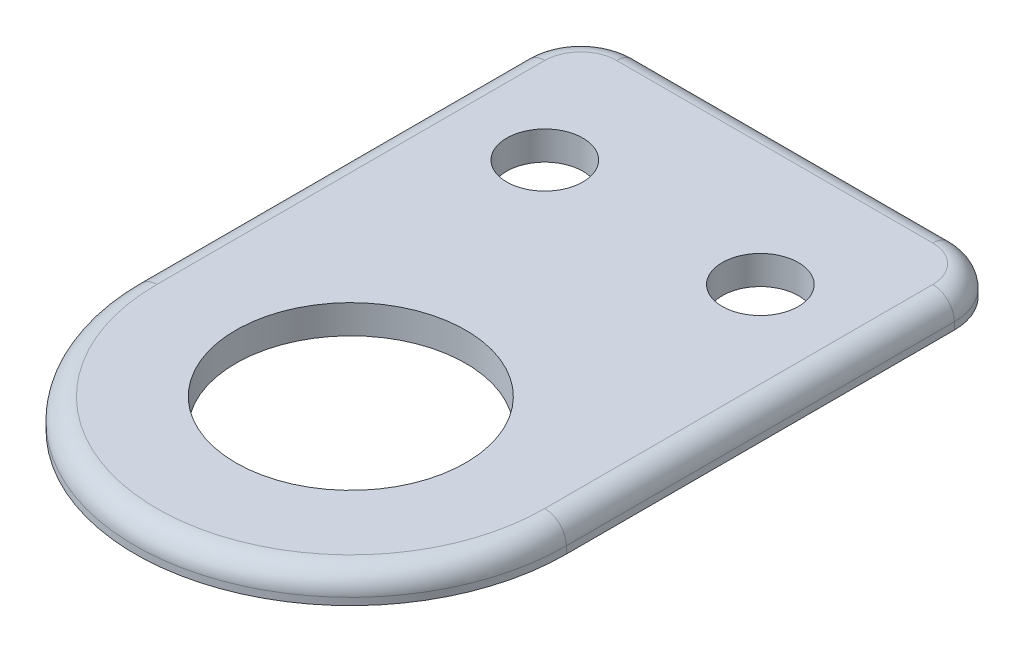
ISO-10303-21;
HEADER;
FILE_DESCRIPTION(('STEP AP214'),'2;1');
FILE_NAME('part.step','',(''),(''),'','','');
FILE_SCHEMA(('AUTOMOTIVE_DESIGN { 1 0 10303 214 1 1 1 1 }'));
ENDSEC;
DATA;
#1=APPLICATION_CONTEXT('core data for automotive mechanical design processes');
#2=APPLICATION_PROTOCOL_DEFINITION('international standard','automotive_design',2000,#1);
#3=PRODUCT_CONTEXT('',#1,'mechanical');
#4=PRODUCT('Part','Part','',(#3));
#5=PRODUCT_RELATED_PRODUCT_CATEGORY('part','',(#4));
#6=PRODUCT_DEFINITION_FORMATION('','',#4);
#7=PRODUCT_DEFINITION_CONTEXT('part definition',#1,'design');
#8=PRODUCT_DEFINITION('design','',#6,#7);
#9=PRODUCT_DEFINITION_SHAPE('','',#8);
#10=(LENGTH_UNIT() NAMED_UNIT(*) SI_UNIT(.MILLI.,.METRE.));
#11=(NAMED_UNIT(*) PLANE_ANGLE_UNIT() SI_UNIT($,.RADIAN.));
#12=(NAMED_UNIT(*) SI_UNIT($,.STERADIAN.) SOLID_ANGLE_UNIT());
#13=UNCERTAINTY_MEASURE_WITH_UNIT(LENGTH_MEASURE(1.E-05),#10,'distance_accuracy_value','');
#14=(GEOMETRIC_REPRESENTATION_CONTEXT(3) GLOBAL_UNCERTAINTY_ASSIGNED_CONTEXT((#13)) GLOBAL_UNIT_ASSIGNED_CONTEXT((#10,
#11,#12)) REPRESENTATION_CONTEXT('',''));
#15=CARTESIAN_POINT('',(0.,0.,0.));
#16=DIRECTION('',(0.,0.,1.));
#17=DIRECTION('',(1.,0.,0.));
#18=AXIS2_PLACEMENT_3D('',#15,#16,#17);
#19=CARTESIAN_POINT('',(0.,2.,0.));
#20=DIRECTION('',(0.,1.,0.));
#21=DIRECTION('',(0.,0.,1.));
#22=AXIS2_PLACEMENT_3D('',#19,#20,#21);
#23=PLANE('',#22);
#24=CARTESIAN_POINT('',(0.,2.,0.));
#25=DIRECTION('',(0.,1.,0.));
#26=DIRECTION('',(0.,0.,1.));
#27=AXIS2_PLACEMENT_3D('',#24,#25,#26);
#28=CIRCLE('',#27,13.5);
#29=CARTESIAN_POINT('',(-13.5,2.,0.));
#30=VERTEX_POINT('',#29);
#31=CARTESIAN_POINT('',(13.5,2.,0.));
#32=VERTEX_POINT('',#31);
#33=EDGE_CURVE('E197',#30,#32,#28,.T.);
#34=ORIENTED_EDGE('',*,*,#33,.T.);
#35=DIRECTION('',(0.,0.,-1.));
#36=VECTOR('',#35,1.);
#37=CARTESIAN_POINT('',(13.5,2.,-27.));
#38=LINE('',#37,#36);
#39=CARTESIAN_POINT('',(13.5,2.,-27.));
#40=VERTEX_POINT('',#39);
#41=EDGE_CURVE('E212',#32,#40,#38,.T.);
#42=ORIENTED_EDGE('',*,*,#41,.T.);
#43=CARTESIAN_POINT('',(11.,2.,-27.));
#44=DIRECTION('',(0.,1.,0.));
#45=DIRECTION('',(0.,0.,1.));
#46=AXIS2_PLACEMENT_3D('',#43,#44,#45);
#47=CIRCLE('',#46,2.5);
#48=CARTESIAN_POINT('',(11.,2.,-29.5));
#49=VERTEX_POINT('',#48);
#50=EDGE_CURVE('E209',#40,#49,#47,.T.);
#51=ORIENTED_EDGE('',*,*,#50,.T.);
#52=DIRECTION('',(1.,0.,0.));
#53=VECTOR('',#52,1.);
#54=CARTESIAN_POINT('',(0.,2.,-29.5));
#55=LINE('',#54,#53);
#56=CARTESIAN_POINT('',(-11.,2.,-29.5));
#57=VERTEX_POINT('',#56);
#58=EDGE_CURVE('E206',#49,#57,#55,.F.);
#59=ORIENTED_EDGE('',*,*,#58,.T.);
#60=CARTESIAN_POINT('',(-11.,2.,-27.));
#61=DIRECTION('',(0.,1.,0.));
#62=DIRECTION('',(0.,0.,1.));
#63=AXIS2_PLACEMENT_3D('',#60,#61,#62);
#64=CIRCLE('',#63,2.5);
#65=CARTESIAN_POINT('',(-13.5,2.,-27.));
#66=VERTEX_POINT('',#65);
#67=EDGE_CURVE('E203',#57,#66,#64,.T.);
#68=ORIENTED_EDGE('',*,*,#67,.T.);
#69=DIRECTION('',(0.,0.,-1.));
#70=VECTOR('',#69,1.);
#71=CARTESIAN_POINT('',(-13.5,2.,0.));
#72=LINE('',#71,#70);
#73=EDGE_CURVE('E200',#66,#30,#72,.F.);
#74=ORIENTED_EDGE('',*,*,#73,.T.);
#75=EDGE_LOOP('',(#34,#42,#51,#59,#68,#74));
#76=FACE_BOUND('',#75,.T.);
#77=CARTESIAN_POINT('',(-7.5,2.,-21.));
#78=DIRECTION('',(0.,1.,0.));
#79=DIRECTION('',(0.,0.,1.));
#80=AXIS2_PLACEMENT_3D('',#77,#78,#79);
#81=CIRCLE('',#80,2.65);
#82=CARTESIAN_POINT('',(-7.5,2.,-18.35));
#83=VERTEX_POINT('',#82);
#84=EDGE_CURVE('E250',#83,#83,#81,.T.);
#85=ORIENTED_EDGE('',*,*,#84,.F.);
#86=EDGE_LOOP('',(#85));
#87=FACE_BOUND('',#86,.T.);
#88=CARTESIAN_POINT('',(7.5,2.,-21.));
#89=DIRECTION('',(0.,1.,0.));
#90=DIRECTION('',(0.,0.,1.));
#91=AXIS2_PLACEMENT_3D('',#88,#89,#90);
#92=CIRCLE('',#91,2.65);
#93=CARTESIAN_POINT('',(7.5,2.,-18.35));
#94=VERTEX_POINT('',#93);
#95=EDGE_CURVE('E263',#94,#94,#92,.T.);
#96=ORIENTED_EDGE('',*,*,#95,.F.);
#97=EDGE_LOOP('',(#96));
#98=FACE_BOUND('',#97,.T.);
#99=CARTESIAN_POINT('',(0.,2.,0.));
#100=DIRECTION('',(0.,1.,0.));
#101=DIRECTION('',(0.,0.,1.));
#102=AXIS2_PLACEMENT_3D('',#99,#100,#101);
#103=CIRCLE('',#102,8.);
#104=CARTESIAN_POINT('',(0.,2.,8.));
#105=VERTEX_POINT('',#104);
#106=EDGE_CURVE('E164',#105,#105,#103,.T.);
#107=ORIENTED_EDGE('',*,*,#106,.F.);
#108=EDGE_LOOP('',(#107));
#109=FACE_BOUND('',#108,.T.);
#110=ADVANCED_FACE('F64',(#76,#87,#98,#109),#23,.T.);
#111=CARTESIAN_POINT('',(0.,0.,0.));
#112=DIRECTION('',(0.,1.,0.));
#113=DIRECTION('',(0.,0.,1.));
#114=AXIS2_PLACEMENT_3D('',#111,#112,#113);
#115=PLANE('',#114);
#116=CARTESIAN_POINT('',(-7.5,0.,-21.));
#117=DIRECTION('',(0.,1.,0.));
#118=DIRECTION('',(0.,0.,1.));
#119=AXIS2_PLACEMENT_3D('',#116,#117,#118);
#120=CIRCLE('',#119,2.65);
#121=CARTESIAN_POINT('',(-7.5,0.,-18.35));
#122=VERTEX_POINT('',#121);
#123=EDGE_CURVE('E256',#122,#122,#120,.T.);
#124=ORIENTED_EDGE('',*,*,#123,.T.);
#125=EDGE_LOOP('',(#124));
#126=FACE_BOUND('',#125,.T.);
#127=CARTESIAN_POINT('',(7.5,0.,-21.));
#128=DIRECTION('',(0.,1.,0.));
#129=DIRECTION('',(0.,0.,1.));
#130=AXIS2_PLACEMENT_3D('',#127,#128,#129);
#131=CIRCLE('',#130,2.65);
#132=CARTESIAN_POINT('',(7.5,0.,-18.35));
#133=VERTEX_POINT('',#132);
#134=EDGE_CURVE('E269',#133,#133,#131,.T.);
#135=ORIENTED_EDGE('',*,*,#134,.T.);
#136=EDGE_LOOP('',(#135));
#137=FACE_BOUND('',#136,.T.);
#138=DIRECTION('',(1.,0.,0.));
#139=VECTOR('',#138,1.);
#140=CARTESIAN_POINT('',(0.,0.,-31.));
#141=LINE('',#140,#139);
#142=CARTESIAN_POINT('',(-11.,0.,-31.));
#143=VERTEX_POINT('',#142);
#144=CARTESIAN_POINT('',(11.,0.,-31.));
#145=VERTEX_POINT('',#144);
#146=EDGE_CURVE('E160',#143,#145,#141,.T.);
#147=ORIENTED_EDGE('',*,*,#146,.T.);
#148=CARTESIAN_POINT('',(11.,0.,-27.));
#149=DIRECTION('',(0.,1.,0.));
#150=DIRECTION('',(0.,0.,1.));
#151=AXIS2_PLACEMENT_3D('',#148,#149,#150);
#152=CIRCLE('',#151,4.);
#153=CARTESIAN_POINT('',(15.,0.,-27.));
#154=VERTEX_POINT('',#153);
#155=EDGE_CURVE('E158',#145,#154,#152,.F.);
#156=ORIENTED_EDGE('',*,*,#155,.T.);
#157=DIRECTION('',(0.,0.,-1.));
#158=VECTOR('',#157,1.);
#159=CARTESIAN_POINT('',(15.,0.,0.));
#160=LINE('',#159,#158);
#161=CARTESIAN_POINT('',(15.,0.,0.));
#162=VERTEX_POINT('',#161);
#163=EDGE_CURVE('E140',#162,#154,#160,.T.);
#164=ORIENTED_EDGE('',*,*,#163,.F.);
#165=CARTESIAN_POINT('',(0.,0.,0.));
#166=DIRECTION('',(0.,1.,0.));
#167=DIRECTION('',(0.,0.,1.));
#168=AXIS2_PLACEMENT_3D('',#165,#166,#167);
#169=CIRCLE('',#168,15.);
#170=CARTESIAN_POINT('',(-15.,0.,0.));
#171=VERTEX_POINT('',#170);
#172=EDGE_CURVE('E155',#162,#171,#169,.F.);
#173=ORIENTED_EDGE('',*,*,#172,.T.);
#174=DIRECTION('',(0.,0.,-1.));
#175=VECTOR('',#174,1.);
#176=CARTESIAN_POINT('',(-15.,0.,0.));
#177=LINE('',#176,#175);
#178=CARTESIAN_POINT('',(-15.,0.,-27.));
#179=VERTEX_POINT('',#178);
#180=EDGE_CURVE('E175',#171,#179,#177,.T.);
#181=ORIENTED_EDGE('',*,*,#180,.T.);
#182=CARTESIAN_POINT('',(-11.,0.,-27.));
#183=DIRECTION('',(0.,1.,0.));
#184=DIRECTION('',(0.,0.,1.));
#185=AXIS2_PLACEMENT_3D('',#182,#183,#184);
#186=CIRCLE('',#185,4.);
#187=EDGE_CURVE('E186',#179,#143,#186,.F.);
#188=ORIENTED_EDGE('',*,*,#187,.T.);
#189=EDGE_LOOP('',(#147,#156,#164,#173,#181,#188));
#190=FACE_BOUND('',#189,.T.);
#191=CARTESIAN_POINT('',(0.,0.,0.));
#192=DIRECTION('',(0.,1.,0.));
#193=DIRECTION('',(0.,0.,1.));
#194=AXIS2_PLACEMENT_3D('',#191,#192,#193);
#195=CIRCLE('',#194,8.);
#196=CARTESIAN_POINT('',(0.,0.,8.));
#197=VERTEX_POINT('',#196);
#198=EDGE_CURVE('E169',#197,#197,#195,.T.);
#199=ORIENTED_EDGE('',*,*,#198,.T.);
#200=EDGE_LOOP('',(#199));
#201=FACE_BOUND('',#200,.T.);
#202=ADVANCED_FACE('F152',(#126,#137,#190,#201),#115,.F.);
#203=CARTESIAN_POINT('',(0.,2.,0.));
#204=DIRECTION('',(0.,-1.,0.));
#205=DIRECTION('',(0.,0.,-1.));
#206=AXIS2_PLACEMENT_3D('',#203,#204,#205);
#207=CYLINDRICAL_SURFACE('',#206,15.);
#208=DIRECTION('',(0.,-1.,0.));
#209=VECTOR('',#208,1.);
#210=CARTESIAN_POINT('',(15.,2.,0.));
#211=LINE('',#210,#209);
#212=CARTESIAN_POINT('',(15.,0.5,0.));
#213=VERTEX_POINT('',#212);
#214=EDGE_CURVE('E136',#213,#162,#211,.T.);
#215=ORIENTED_EDGE('',*,*,#214,.F.);
#216=CARTESIAN_POINT('',(0.,0.5,0.));
#217=DIRECTION('',(0.,1.,0.));
#218=DIRECTION('',(0.,0.,1.));
#219=AXIS2_PLACEMENT_3D('',#216,#217,#218);
#220=CIRCLE('',#219,15.);
#221=CARTESIAN_POINT('',(-15.,0.5,0.));
#222=VERTEX_POINT('',#221);
#223=EDGE_CURVE('E12',#213,#222,#220,.F.);
#224=ORIENTED_EDGE('',*,*,#223,.T.);
#225=DIRECTION('',(0.,-1.,0.));
#226=VECTOR('',#225,1.);
#227=CARTESIAN_POINT('',(-15.,2.,0.));
#228=LINE('',#227,#226);
#229=EDGE_CURVE('E147',#222,#171,#228,.T.);
#230=ORIENTED_EDGE('',*,*,#229,.T.);
#231=ORIENTED_EDGE('',*,*,#172,.F.);
#232=EDGE_LOOP('',(#215,#224,#230,#231));
#233=FACE_BOUND('',#232,.T.);
#234=ADVANCED_FACE('F162',(#233),#207,.T.);
#235=CARTESIAN_POINT('',(15.,2.,0.));
#236=DIRECTION('',(-1.,0.,0.));
#237=DIRECTION('',(0.,0.,1.));
#238=AXIS2_PLACEMENT_3D('',#235,#236,#237);
#239=PLANE('',#238);
#240=DIRECTION('',(0.,-1.,0.));
#241=VECTOR('',#240,1.);
#242=CARTESIAN_POINT('',(15.,2.,-27.));
#243=LINE('',#242,#241);
#244=CARTESIAN_POINT('',(15.,0.5,-27.));
#245=VERTEX_POINT('',#244);
#246=EDGE_CURVE('E191',#154,#245,#243,.F.);
#247=ORIENTED_EDGE('',*,*,#246,.T.);
#248=DIRECTION('',(0.,0.,-1.));
#249=VECTOR('',#248,1.);
#250=CARTESIAN_POINT('',(15.,0.5,0.));
#251=LINE('',#250,#249);
#252=EDGE_CURVE('E143',#245,#213,#251,.F.);
#253=ORIENTED_EDGE('',*,*,#252,.T.);
#254=ORIENTED_EDGE('',*,*,#214,.T.);
#255=ORIENTED_EDGE('',*,*,#163,.T.);
#256=EDGE_LOOP('',(#247,#253,#254,#255));
#257=FACE_BOUND('',#256,.T.);
#258=ADVANCED_FACE('F139',(#257),#239,.F.);
#259=CARTESIAN_POINT('',(0.,2.,-31.));
#260=DIRECTION('',(0.,0.,-1.));
#261=DIRECTION('',(-1.,0.,0.));
#262=AXIS2_PLACEMENT_3D('',#259,#260,#261);
#263=PLANE('',#262);
#264=DIRECTION('',(0.,-1.,0.));
#265=VECTOR('',#264,1.);
#266=CARTESIAN_POINT('',(-11.,2.,-31.));
#267=LINE('',#266,#265);
#268=CARTESIAN_POINT('',(-11.,0.5,-31.));
#269=VERTEX_POINT('',#268);
#270=EDGE_CURVE('E146',#143,#269,#267,.F.);
#271=ORIENTED_EDGE('',*,*,#270,.T.);
#272=DIRECTION('',(1.,0.,0.));
#273=VECTOR('',#272,1.);
#274=CARTESIAN_POINT('',(0.,0.5,-31.));
#275=LINE('',#274,#273);
#276=CARTESIAN_POINT('',(11.,0.5,-31.));
#277=VERTEX_POINT('',#276);
#278=EDGE_CURVE('E221',#269,#277,#275,.T.);
#279=ORIENTED_EDGE('',*,*,#278,.T.);
#280=DIRECTION('',(0.,-1.,0.));
#281=VECTOR('',#280,1.);
#282=CARTESIAN_POINT('',(11.,0.,-31.));
#283=LINE('',#282,#281);
#284=EDGE_CURVE('E183',#277,#145,#283,.T.);
#285=ORIENTED_EDGE('',*,*,#284,.T.);
#286=ORIENTED_EDGE('',*,*,#146,.F.);
#287=EDGE_LOOP('',(#271,#279,#285,#286));
#288=FACE_BOUND('',#287,.T.);
#289=ADVANCED_FACE('F289',(#288),#263,.T.);
#290=CARTESIAN_POINT('',(-15.,2.,0.));
#291=DIRECTION('',(-1.,0.,0.));
#292=DIRECTION('',(0.,0.,1.));
#293=AXIS2_PLACEMENT_3D('',#290,#291,#292);
#294=PLANE('',#293);
#295=ORIENTED_EDGE('',*,*,#229,.F.);
#296=DIRECTION('',(0.,0.,-1.));
#297=VECTOR('',#296,1.);
#298=CARTESIAN_POINT('',(-15.,0.5,0.));
#299=LINE('',#298,#297);
#300=CARTESIAN_POINT('',(-15.,0.5,-27.));
#301=VERTEX_POINT('',#300);
#302=EDGE_CURVE('E74',#222,#301,#299,.T.);
#303=ORIENTED_EDGE('',*,*,#302,.T.);
#304=DIRECTION('',(0.,-1.,0.));
#305=VECTOR('',#304,1.);
#306=CARTESIAN_POINT('',(-15.,2.,-27.));
#307=LINE('',#306,#305);
#308=EDGE_CURVE('E194',#301,#179,#307,.T.);
#309=ORIENTED_EDGE('',*,*,#308,.T.);
#310=ORIENTED_EDGE('',*,*,#180,.F.);
#311=EDGE_LOOP('',(#295,#303,#309,#310));
#312=FACE_BOUND('',#311,.T.);
#313=ADVANCED_FACE('F280',(#312),#294,.T.);
#314=CARTESIAN_POINT('',(0.,2.,0.));
#315=DIRECTION('',(0.,-1.,0.));
#316=DIRECTION('',(0.,0.,-1.));
#317=AXIS2_PLACEMENT_3D('',#314,#315,#316);
#318=CYLINDRICAL_SURFACE('',#317,8.);
#319=ORIENTED_EDGE('',*,*,#106,.T.);
#320=EDGE_LOOP('',(#319));
#321=FACE_BOUND('',#320,.T.);
#322=ORIENTED_EDGE('',*,*,#198,.F.);
#323=EDGE_LOOP('',(#322));
#324=FACE_BOUND('',#323,.T.);
#325=ADVANCED_FACE('F277',(#321,#324),#318,.F.);
#326=CARTESIAN_POINT('',(7.5,2.,-21.));
#327=DIRECTION('',(0.,1.,0.));
#328=DIRECTION('',(0.,0.,1.));
#329=AXIS2_PLACEMENT_3D('',#326,#327,#328);
#330=CYLINDRICAL_SURFACE('',#329,2.65);
#331=ORIENTED_EDGE('',*,*,#134,.F.);
#332=EDGE_LOOP('',(#331));
#333=FACE_BOUND('',#332,.T.);
#334=ORIENTED_EDGE('',*,*,#95,.T.);
#335=EDGE_LOOP('',(#334));
#336=FACE_BOUND('',#335,.T.);
#337=ADVANCED_FACE('F279',(#333,#336),#330,.F.);
#338=CARTESIAN_POINT('',(-7.5,2.,-21.));
#339=DIRECTION('',(0.,1.,0.));
#340=DIRECTION('',(0.,0.,1.));
#341=AXIS2_PLACEMENT_3D('',#338,#339,#340);
#342=CYLINDRICAL_SURFACE('',#341,2.65);
#343=ORIENTED_EDGE('',*,*,#123,.F.);
#344=EDGE_LOOP('',(#343));
#345=FACE_BOUND('',#344,.T.);
#346=ORIENTED_EDGE('',*,*,#84,.T.);
#347=EDGE_LOOP('',(#346));
#348=FACE_BOUND('',#347,.T.);
#349=ADVANCED_FACE('F286',(#345,#348),#342,.F.);
#350=CARTESIAN_POINT('',(11.,2.,-27.));
#351=DIRECTION('',(0.,1.,0.));
#352=DIRECTION('',(0.,0.,1.));
#353=AXIS2_PLACEMENT_3D('',#350,#351,#352);
#354=CYLINDRICAL_SURFACE('',#353,4.);
#355=ORIENTED_EDGE('',*,*,#284,.F.);
#356=CARTESIAN_POINT('',(11.,0.5,-27.));
#357=DIRECTION('',(0.,1.,0.));
#358=DIRECTION('',(0.,0.,1.));
#359=AXIS2_PLACEMENT_3D('',#356,#357,#358);
#360=CIRCLE('',#359,4.);
#361=EDGE_CURVE('E218',#277,#245,#360,.F.);
#362=ORIENTED_EDGE('',*,*,#361,.T.);
#363=ORIENTED_EDGE('',*,*,#246,.F.);
#364=ORIENTED_EDGE('',*,*,#155,.F.);
#365=EDGE_LOOP('',(#355,#362,#363,#364));
#366=FACE_BOUND('',#365,.T.);
#367=ADVANCED_FACE('F307',(#366),#354,.T.);
#368=CARTESIAN_POINT('',(-11.,2.,-27.));
#369=DIRECTION('',(0.,-1.,0.));
#370=DIRECTION('',(0.,0.,-1.));
#371=AXIS2_PLACEMENT_3D('',#368,#369,#370);
#372=CYLINDRICAL_SURFACE('',#371,4.);
#373=ORIENTED_EDGE('',*,*,#308,.F.);
#374=CARTESIAN_POINT('',(-11.,0.5,-27.));
#375=DIRECTION('',(0.,1.,0.));
#376=DIRECTION('',(0.,0.,1.));
#377=AXIS2_PLACEMENT_3D('',#374,#375,#376);
#378=CIRCLE('',#377,4.);
#379=EDGE_CURVE('E224',#301,#269,#378,.F.);
#380=ORIENTED_EDGE('',*,*,#379,.T.);
#381=ORIENTED_EDGE('',*,*,#270,.F.);
#382=ORIENTED_EDGE('',*,*,#187,.F.);
#383=EDGE_LOOP('',(#373,#380,#381,#382));
#384=FACE_BOUND('',#383,.T.);
#385=ADVANCED_FACE('F310',(#384),#372,.T.);
#386=CARTESIAN_POINT('',(-11.,0.5,-27.));
#387=DIRECTION('',(0.,1.,0.));
#388=DIRECTION('',(0.,0.,1.));
#389=AXIS2_PLACEMENT_3D('',#386,#387,#388);
#390=TOROIDAL_SURFACE('',#389,2.5,1.5);
#391=CARTESIAN_POINT('',(-11.,0.5,-29.5));
#392=DIRECTION('',(1.,0.,0.));
#393=DIRECTION('',(0.,0.,-1.));
#394=AXIS2_PLACEMENT_3D('',#391,#392,#393);
#395=CIRCLE('',#394,1.5);
#396=EDGE_CURVE('E241',#269,#57,#395,.T.);
#397=ORIENTED_EDGE('',*,*,#396,.F.);
#398=ORIENTED_EDGE('',*,*,#379,.F.);
#399=CARTESIAN_POINT('',(-13.5,0.5,-27.));
#400=DIRECTION('',(0.,0.,1.));
#401=DIRECTION('',(1.,0.,0.));
#402=AXIS2_PLACEMENT_3D('',#399,#400,#401);
#403=CIRCLE('',#402,1.5);
#404=EDGE_CURVE('E68',#66,#301,#403,.T.);
#405=ORIENTED_EDGE('',*,*,#404,.F.);
#406=ORIENTED_EDGE('',*,*,#67,.F.);
#407=EDGE_LOOP('',(#397,#398,#405,#406));
#408=FACE_BOUND('',#407,.T.);
#409=ADVANCED_FACE('F66',(#408),#390,.T.);
#410=CARTESIAN_POINT('',(-13.5,0.5,0.));
#411=DIRECTION('',(0.,0.,-1.));
#412=DIRECTION('',(-1.,0.,0.));
#413=AXIS2_PLACEMENT_3D('',#410,#411,#412);
#414=CYLINDRICAL_SURFACE('',#413,1.5);
#415=ORIENTED_EDGE('',*,*,#404,.T.);
#416=ORIENTED_EDGE('',*,*,#302,.F.);
#417=CARTESIAN_POINT('',(-13.5,0.5,0.));
#418=DIRECTION('',(0.,0.,1.));
#419=DIRECTION('',(1.,0.,0.));
#420=AXIS2_PLACEMENT_3D('',#417,#418,#419);
#421=CIRCLE('',#420,1.5);
#422=EDGE_CURVE('E238',#30,#222,#421,.T.);
#423=ORIENTED_EDGE('',*,*,#422,.F.);
#424=ORIENTED_EDGE('',*,*,#73,.F.);
#425=EDGE_LOOP('',(#415,#416,#423,#424));
#426=FACE_BOUND('',#425,.T.);
#427=ADVANCED_FACE('F329',(#426),#414,.T.);
#428=CARTESIAN_POINT('',(0.,0.5,-29.5));
#429=DIRECTION('',(1.,0.,0.));
#430=DIRECTION('',(0.,0.,-1.));
#431=AXIS2_PLACEMENT_3D('',#428,#429,#430);
#432=CYLINDRICAL_SURFACE('',#431,1.5);
#433=ORIENTED_EDGE('',*,*,#396,.T.);
#434=ORIENTED_EDGE('',*,*,#58,.F.);
#435=CARTESIAN_POINT('',(11.,0.5,-29.5));
#436=DIRECTION('',(1.,0.,0.));
#437=DIRECTION('',(0.,0.,-1.));
#438=AXIS2_PLACEMENT_3D('',#435,#436,#437);
#439=CIRCLE('',#438,1.5);
#440=EDGE_CURVE('E234',#277,#49,#439,.T.);
#441=ORIENTED_EDGE('',*,*,#440,.F.);
#442=ORIENTED_EDGE('',*,*,#278,.F.);
#443=EDGE_LOOP('',(#433,#434,#441,#442));
#444=FACE_BOUND('',#443,.T.);
#445=ADVANCED_FACE('F326',(#444),#432,.T.);
#446=CARTESIAN_POINT('',(0.,0.5,0.));
#447=DIRECTION('',(0.,1.,0.));
#448=DIRECTION('',(0.,0.,1.));
#449=AXIS2_PLACEMENT_3D('',#446,#447,#448);
#450=TOROIDAL_SURFACE('',#449,13.5,1.5);
#451=ORIENTED_EDGE('',*,*,#422,.T.);
#452=ORIENTED_EDGE('',*,*,#223,.F.);
#453=CARTESIAN_POINT('',(13.5,0.5,0.));
#454=DIRECTION('',(0.,0.,-1.));
#455=DIRECTION('',(-1.,0.,0.));
#456=AXIS2_PLACEMENT_3D('',#453,#454,#455);
#457=CIRCLE('',#456,1.5);
#458=EDGE_CURVE('E231',#32,#213,#457,.T.);
#459=ORIENTED_EDGE('',*,*,#458,.F.);
#460=ORIENTED_EDGE('',*,*,#33,.F.);
#461=EDGE_LOOP('',(#451,#452,#459,#460));
#462=FACE_BOUND('',#461,.T.);
#463=ADVANCED_FACE('F322',(#462),#450,.T.);
#464=CARTESIAN_POINT('',(11.,0.5,-27.));
#465=DIRECTION('',(0.,1.,0.));
#466=DIRECTION('',(0.,0.,1.));
#467=AXIS2_PLACEMENT_3D('',#464,#465,#466);
#468=TOROIDAL_SURFACE('',#467,2.5,1.5);
#469=ORIENTED_EDGE('',*,*,#440,.T.);
#470=ORIENTED_EDGE('',*,*,#50,.F.);
#471=CARTESIAN_POINT('',(13.5,0.5,-27.));
#472=DIRECTION('',(0.,0.,1.));
#473=DIRECTION('',(1.,0.,0.));
#474=AXIS2_PLACEMENT_3D('',#471,#472,#473);
#475=CIRCLE('',#474,1.5);
#476=EDGE_CURVE('E228',#245,#40,#475,.T.);
#477=ORIENTED_EDGE('',*,*,#476,.F.);
#478=ORIENTED_EDGE('',*,*,#361,.F.);
#479=EDGE_LOOP('',(#469,#470,#477,#478));
#480=FACE_BOUND('',#479,.T.);
#481=ADVANCED_FACE('F318',(#480),#468,.T.);
#482=CARTESIAN_POINT('',(13.5,0.5,0.));
#483=DIRECTION('',(0.,0.,1.));
#484=DIRECTION('',(1.,0.,0.));
#485=AXIS2_PLACEMENT_3D('',#482,#483,#484);
#486=CYLINDRICAL_SURFACE('',#485,1.5);
#487=ORIENTED_EDGE('',*,*,#458,.T.);
#488=ORIENTED_EDGE('',*,*,#252,.F.);
#489=ORIENTED_EDGE('',*,*,#476,.T.);
#490=ORIENTED_EDGE('',*,*,#41,.F.);
#491=EDGE_LOOP('',(#487,#488,#489,#490));
#492=FACE_BOUND('',#491,.T.);
#493=ADVANCED_FACE('F315',(#492),#486,.T.);
#494=CLOSED_SHELL('',(#110,#202,#234,#258,#289,#313,#325,#337,#349,#367,#385,#409,#427,#445,
#463,#481,#493));
#495=MANIFOLD_SOLID_BREP('B2',#494);
#496=ADVANCED_BREP_SHAPE_REPRESENTATION('',(#18,#495),#14);
#497=SHAPE_DEFINITION_REPRESENTATION(#9,#496);
ENDSEC;
END-ISO-10303-21;
